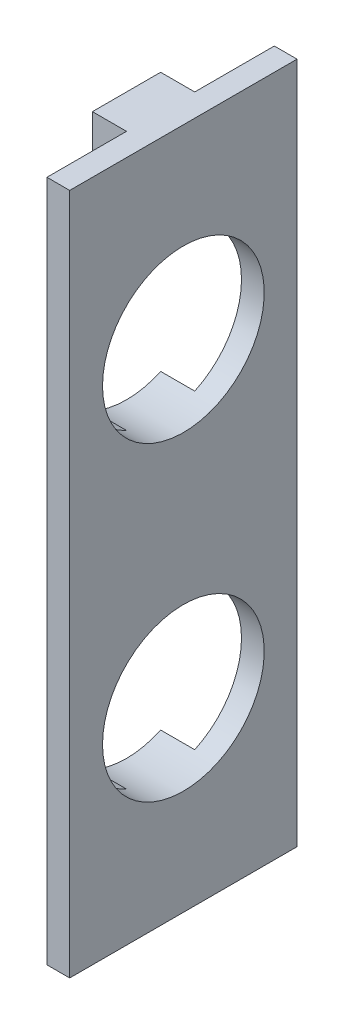
ISO-10303-21;
HEADER;
FILE_DESCRIPTION(('STEP AP214'),'2;1');
FILE_NAME('part.step','',(''),(''),'','','');
FILE_SCHEMA(('AUTOMOTIVE_DESIGN { 1 0 10303 214 1 1 1 1 }'));
ENDSEC;
DATA;
#1=APPLICATION_CONTEXT('core data for automotive mechanical design processes');
#2=APPLICATION_PROTOCOL_DEFINITION('international standard','automotive_design',2000,#1);
#3=PRODUCT_CONTEXT('',#1,'mechanical');
#4=PRODUCT('Part','Part','',(#3));
#5=PRODUCT_RELATED_PRODUCT_CATEGORY('part','',(#4));
#6=PRODUCT_DEFINITION_FORMATION('','',#4);
#7=PRODUCT_DEFINITION_CONTEXT('part definition',#1,'design');
#8=PRODUCT_DEFINITION('design','',#6,#7);
#9=PRODUCT_DEFINITION_SHAPE('','',#8);
#10=(LENGTH_UNIT() NAMED_UNIT(*) SI_UNIT(.MILLI.,.METRE.));
#11=(NAMED_UNIT(*) PLANE_ANGLE_UNIT() SI_UNIT($,.RADIAN.));
#12=(NAMED_UNIT(*) SI_UNIT($,.STERADIAN.) SOLID_ANGLE_UNIT());
#13=UNCERTAINTY_MEASURE_WITH_UNIT(LENGTH_MEASURE(1.E-05),#10,'distance_accuracy_value','');
#14=(GEOMETRIC_REPRESENTATION_CONTEXT(3) GLOBAL_UNCERTAINTY_ASSIGNED_CONTEXT((#13)) GLOBAL_UNIT_ASSIGNED_CONTEXT((#10,
#11,#12)) REPRESENTATION_CONTEXT('',''));
#15=CARTESIAN_POINT('',(0.,0.,0.));
#16=DIRECTION('',(0.,0.,1.));
#17=DIRECTION('',(1.,0.,0.));
#18=AXIS2_PLACEMENT_3D('',#15,#16,#17);
#19=CARTESIAN_POINT('',(-1.62605042016807,30.,0.));
#20=DIRECTION('',(0.,0.,-1.));
#21=DIRECTION('',(-1.,0.,0.));
#22=AXIS2_PLACEMENT_3D('',#19,#20,#21);
#23=PLANE('',#22);
#24=DIRECTION('',(0.,-1.,0.));
#25=VECTOR('',#24,1.);
#26=CARTESIAN_POINT('',(-1.62605042016807,30.,0.));
#27=LINE('',#26,#25);
#28=CARTESIAN_POINT('',(-1.62605042016807,4.94585901655065,0.));
#29=VERTEX_POINT('',#28);
#30=CARTESIAN_POINT('',(-1.62605042016807,0.,0.));
#31=VERTEX_POINT('',#30);
#32=EDGE_CURVE('E258',#29,#31,#27,.T.);
#33=ORIENTED_EDGE('',*,*,#32,.F.);
#34=DIRECTION('',(-1.,0.,0.));
#35=VECTOR('',#34,1.);
#36=CARTESIAN_POINT('',(26.8739495798319,4.94585901655065,0.));
#37=LINE('',#36,#35);
#38=CARTESIAN_POINT('',(-3.12605042016807,4.94585901655065,0.));
#39=VERTEX_POINT('',#38);
#40=EDGE_CURVE('E259',#29,#39,#37,.T.);
#41=ORIENTED_EDGE('',*,*,#40,.T.);
#42=DIRECTION('',(0.,-1.,0.));
#43=VECTOR('',#42,1.);
#44=CARTESIAN_POINT('',(-3.12605042016807,30.,0.));
#45=LINE('',#44,#43);
#46=CARTESIAN_POINT('',(-3.12605042016807,0.,0.));
#47=VERTEX_POINT('',#46);
#48=EDGE_CURVE('E158',#39,#47,#45,.T.);
#49=ORIENTED_EDGE('',*,*,#48,.T.);
#50=DIRECTION('',(1.,0.,0.));
#51=VECTOR('',#50,1.);
#52=CARTESIAN_POINT('',(-1.62605042016807,0.,0.));
#53=LINE('',#52,#51);
#54=EDGE_CURVE('E211',#47,#31,#53,.T.);
#55=ORIENTED_EDGE('',*,*,#54,.T.);
#56=EDGE_LOOP('',(#33,#41,#49,#55));
#57=FACE_BOUND('',#56,.T.);
#58=ADVANCED_FACE('F33',(#57),#23,.F.);
#59=CARTESIAN_POINT('',(-3.12605042016807,30.,-3.));
#60=DIRECTION('',(0.,0.,1.));
#61=DIRECTION('',(1.,0.,0.));
#62=AXIS2_PLACEMENT_3D('',#59,#60,#61);
#63=PLANE('',#62);
#64=DIRECTION('',(0.,-1.,0.));
#65=VECTOR('',#64,1.);
#66=CARTESIAN_POINT('',(-1.62605042016807,30.,-3.));
#67=LINE('',#66,#65);
#68=CARTESIAN_POINT('',(-1.62605042016807,18.605843223575,-3.));
#69=VERTEX_POINT('',#68);
#70=CARTESIAN_POINT('',(-1.62605042016807,11.394156776425,-3.));
#71=VERTEX_POINT('',#70);
#72=EDGE_CURVE('E185',#69,#71,#67,.T.);
#73=ORIENTED_EDGE('',*,*,#72,.T.);
#74=DIRECTION('',(-1.,0.,0.));
#75=VECTOR('',#74,1.);
#76=CARTESIAN_POINT('',(26.8739495798319,11.394156776425,-3.));
#77=LINE('',#76,#75);
#78=CARTESIAN_POINT('',(-3.12605042016807,11.394156776425,-3.));
#79=VERTEX_POINT('',#78);
#80=EDGE_CURVE('E48',#71,#79,#77,.T.);
#81=ORIENTED_EDGE('',*,*,#80,.T.);
#82=DIRECTION('',(0.,-1.,0.));
#83=VECTOR('',#82,1.);
#84=CARTESIAN_POINT('',(-3.12605042016807,30.,-3.));
#85=LINE('',#84,#83);
#86=CARTESIAN_POINT('',(-3.12605042016807,18.605843223575,-3.));
#87=VERTEX_POINT('',#86);
#88=EDGE_CURVE('E164',#87,#79,#85,.T.);
#89=ORIENTED_EDGE('',*,*,#88,.F.);
#90=DIRECTION('',(-1.,0.,0.));
#91=VECTOR('',#90,1.);
#92=CARTESIAN_POINT('',(26.8739495798319,18.605843223575,-3.));
#93=LINE('',#92,#91);
#94=EDGE_CURVE('E297',#87,#69,#93,.F.);
#95=ORIENTED_EDGE('',*,*,#94,.T.);
#96=EDGE_LOOP('',(#73,#81,#89,#95));
#97=FACE_BOUND('',#96,.T.);
#98=ADVANCED_FACE('F319',(#97),#63,.F.);
#99=CARTESIAN_POINT('',(-3.12605042016807,30.,0.));
#100=DIRECTION('',(1.,0.,0.));
#101=DIRECTION('',(0.,0.,-1.));
#102=AXIS2_PLACEMENT_3D('',#99,#100,#101);
#103=PLANE('',#102);
#104=ORIENTED_EDGE('',*,*,#88,.T.);
#105=CARTESIAN_POINT('',(-3.12605042016807,8.1700078964878,-1.5));
#106=DIRECTION('',(-1.,0.,0.));
#107=DIRECTION('',(0.,0.,-1.));
#108=AXIS2_PLACEMENT_3D('',#105,#106,#107);
#109=CIRCLE('',#108,3.556);
#110=CARTESIAN_POINT('',(-3.12605042016807,11.394156776425,0.));
#111=VERTEX_POINT('',#110);
#112=EDGE_CURVE('E159',#111,#79,#109,.T.);
#113=ORIENTED_EDGE('',*,*,#112,.F.);
#114=CARTESIAN_POINT('',(-3.12605042016807,18.605843223575,0.));
#115=VERTEX_POINT('',#114);
#116=EDGE_CURVE('E170',#115,#111,#45,.T.);
#117=ORIENTED_EDGE('',*,*,#116,.F.);
#118=CARTESIAN_POINT('',(-3.12605042016807,21.8299921035122,-1.5));
#119=DIRECTION('',(-1.,0.,0.));
#120=DIRECTION('',(0.,0.,1.));
#121=AXIS2_PLACEMENT_3D('',#118,#119,#120);
#122=CIRCLE('',#121,3.556);
#123=EDGE_CURVE('E289',#87,#115,#122,.T.);
#124=ORIENTED_EDGE('',*,*,#123,.F.);
#125=EDGE_LOOP('',(#104,#113,#117,#124));
#126=FACE_BOUND('',#125,.T.);
#127=ADVANCED_FACE('F313',(#126),#103,.F.);
#128=CARTESIAN_POINT('',(-1.62605042016807,30.,-3.));
#129=VERTEX_POINT('',#128);
#130=CARTESIAN_POINT('',(-1.62605042016807,25.0541409834494,-3.));
#131=VERTEX_POINT('',#130);
#132=EDGE_CURVE('E182',#129,#131,#67,.T.);
#133=ORIENTED_EDGE('',*,*,#132,.T.);
#134=DIRECTION('',(-1.,0.,0.));
#135=VECTOR('',#134,1.);
#136=CARTESIAN_POINT('',(26.8739495798319,25.0541409834494,-3.));
#137=LINE('',#136,#135);
#138=CARTESIAN_POINT('',(-3.12605042016807,25.0541409834494,-3.));
#139=VERTEX_POINT('',#138);
#140=EDGE_CURVE('E55',#131,#139,#137,.T.);
#141=ORIENTED_EDGE('',*,*,#140,.T.);
#142=CARTESIAN_POINT('',(-3.12605042016807,30.,-3.));
#143=VERTEX_POINT('',#142);
#144=EDGE_CURVE('E167',#143,#139,#85,.T.);
#145=ORIENTED_EDGE('',*,*,#144,.F.);
#146=DIRECTION('',(-1.,0.,0.));
#147=VECTOR('',#146,1.);
#148=CARTESIAN_POINT('',(-3.12605042016807,30.,-3.));
#149=LINE('',#148,#147);
#150=EDGE_CURVE('E190',#129,#143,#149,.T.);
#151=ORIENTED_EDGE('',*,*,#150,.F.);
#152=EDGE_LOOP('',(#133,#141,#145,#151));
#153=FACE_BOUND('',#152,.T.);
#154=ADVANCED_FACE('F188',(#153),#63,.F.);
#155=ORIENTED_EDGE('',*,*,#144,.T.);
#156=CARTESIAN_POINT('',(-3.12605042016807,25.0541409834494,0.));
#157=VERTEX_POINT('',#156);
#158=EDGE_CURVE('E295',#157,#139,#122,.T.);
#159=ORIENTED_EDGE('',*,*,#158,.F.);
#160=CARTESIAN_POINT('',(-3.12605042016807,30.,0.));
#161=VERTEX_POINT('',#160);
#162=EDGE_CURVE('E165',#161,#157,#45,.T.);
#163=ORIENTED_EDGE('',*,*,#162,.F.);
#164=DIRECTION('',(0.,0.,1.));
#165=VECTOR('',#164,1.);
#166=CARTESIAN_POINT('',(-3.12605042016807,30.,0.));
#167=LINE('',#166,#165);
#168=EDGE_CURVE('E223',#143,#161,#167,.T.);
#169=ORIENTED_EDGE('',*,*,#168,.F.);
#170=EDGE_LOOP('',(#155,#159,#163,#169));
#171=FACE_BOUND('',#170,.T.);
#172=ADVANCED_FACE('F311',(#171),#103,.F.);
#173=ORIENTED_EDGE('',*,*,#116,.T.);
#174=DIRECTION('',(-1.,0.,0.));
#175=VECTOR('',#174,1.);
#176=CARTESIAN_POINT('',(26.8739495798319,11.394156776425,0.));
#177=LINE('',#176,#175);
#178=CARTESIAN_POINT('',(-1.62605042016807,11.394156776425,0.));
#179=VERTEX_POINT('',#178);
#180=EDGE_CURVE('E286',#111,#179,#177,.F.);
#181=ORIENTED_EDGE('',*,*,#180,.T.);
#182=CARTESIAN_POINT('',(-1.62605042016807,18.605843223575,0.));
#183=VERTEX_POINT('',#182);
#184=EDGE_CURVE('E263',#183,#179,#27,.T.);
#185=ORIENTED_EDGE('',*,*,#184,.F.);
#186=DIRECTION('',(-1.,0.,0.));
#187=VECTOR('',#186,1.);
#188=CARTESIAN_POINT('',(26.8739495798319,18.605843223575,0.));
#189=LINE('',#188,#187);
#190=EDGE_CURVE('E209',#183,#115,#189,.T.);
#191=ORIENTED_EDGE('',*,*,#190,.T.);
#192=EDGE_LOOP('',(#173,#181,#185,#191));
#193=FACE_BOUND('',#192,.T.);
#194=ADVANCED_FACE('F284',(#193),#23,.F.);
#195=CARTESIAN_POINT('',(-3.12605042016807,4.94585901655065,-3.));
#196=VERTEX_POINT('',#195);
#197=CARTESIAN_POINT('',(-3.12605042016807,0.,-3.));
#198=VERTEX_POINT('',#197);
#199=EDGE_CURVE('E156',#196,#198,#85,.T.);
#200=ORIENTED_EDGE('',*,*,#199,.F.);
#201=DIRECTION('',(-1.,0.,0.));
#202=VECTOR('',#201,1.);
#203=CARTESIAN_POINT('',(26.8739495798319,4.94585901655065,-3.));
#204=LINE('',#203,#202);
#205=CARTESIAN_POINT('',(-1.62605042016807,4.94585901655065,-3.));
#206=VERTEX_POINT('',#205);
#207=EDGE_CURVE('E143',#196,#206,#204,.F.);
#208=ORIENTED_EDGE('',*,*,#207,.T.);
#209=CARTESIAN_POINT('',(-1.62605042016807,0.,-3.));
#210=VERTEX_POINT('',#209);
#211=EDGE_CURVE('E193',#206,#210,#67,.T.);
#212=ORIENTED_EDGE('',*,*,#211,.T.);
#213=DIRECTION('',(-1.,0.,0.));
#214=VECTOR('',#213,1.);
#215=CARTESIAN_POINT('',(-3.12605042016807,0.,-3.));
#216=LINE('',#215,#214);
#217=EDGE_CURVE('E163',#210,#198,#216,.T.);
#218=ORIENTED_EDGE('',*,*,#217,.T.);
#219=EDGE_LOOP('',(#200,#208,#212,#218));
#220=FACE_BOUND('',#219,.T.);
#221=ADVANCED_FACE('F35',(#220),#63,.F.);
#222=ORIENTED_EDGE('',*,*,#48,.F.);
#223=EDGE_CURVE('E146',#196,#39,#109,.T.);
#224=ORIENTED_EDGE('',*,*,#223,.F.);
#225=ORIENTED_EDGE('',*,*,#199,.T.);
#226=DIRECTION('',(0.,0.,1.));
#227=VECTOR('',#226,1.);
#228=CARTESIAN_POINT('',(-3.12605042016807,0.,0.));
#229=LINE('',#228,#227);
#230=EDGE_CURVE('E208',#198,#47,#229,.T.);
#231=ORIENTED_EDGE('',*,*,#230,.T.);
#232=EDGE_LOOP('',(#222,#224,#225,#231));
#233=FACE_BOUND('',#232,.T.);
#234=ADVANCED_FACE('F154',(#233),#103,.F.);
#235=ORIENTED_EDGE('',*,*,#162,.T.);
#236=DIRECTION('',(-1.,0.,0.));
#237=VECTOR('',#236,1.);
#238=CARTESIAN_POINT('',(26.8739495798319,25.0541409834494,0.));
#239=LINE('',#238,#237);
#240=CARTESIAN_POINT('',(-1.62605042016807,25.0541409834494,0.));
#241=VERTEX_POINT('',#240);
#242=EDGE_CURVE('E303',#157,#241,#239,.F.);
#243=ORIENTED_EDGE('',*,*,#242,.T.);
#244=CARTESIAN_POINT('',(-1.62605042016807,30.,0.));
#245=VERTEX_POINT('',#244);
#246=EDGE_CURVE('E260',#245,#241,#27,.T.);
#247=ORIENTED_EDGE('',*,*,#246,.F.);
#248=DIRECTION('',(1.,0.,0.));
#249=VECTOR('',#248,1.);
#250=CARTESIAN_POINT('',(-1.62605042016807,30.,0.));
#251=LINE('',#250,#249);
#252=EDGE_CURVE('E225',#161,#245,#251,.T.);
#253=ORIENTED_EDGE('',*,*,#252,.F.);
#254=EDGE_LOOP('',(#235,#243,#247,#253));
#255=FACE_BOUND('',#254,.T.);
#256=ADVANCED_FACE('F307',(#255),#23,.F.);
#257=CARTESIAN_POINT('',(-1.62605042016807,30.,3.5));
#258=DIRECTION('',(1.,0.,0.));
#259=DIRECTION('',(0.,0.,-1.));
#260=AXIS2_PLACEMENT_3D('',#257,#258,#259);
#261=PLANE('',#260);
#262=ORIENTED_EDGE('',*,*,#184,.T.);
#263=CARTESIAN_POINT('',(-1.62605042016807,8.1700078964878,-1.5));
#264=DIRECTION('',(1.,0.,0.));
#265=DIRECTION('',(0.,0.,-1.));
#266=AXIS2_PLACEMENT_3D('',#263,#264,#265);
#267=CIRCLE('',#266,3.556);
#268=EDGE_CURVE('E277',#179,#29,#267,.T.);
#269=ORIENTED_EDGE('',*,*,#268,.T.);
#270=ORIENTED_EDGE('',*,*,#32,.T.);
#271=DIRECTION('',(0.,0.,1.));
#272=VECTOR('',#271,1.);
#273=CARTESIAN_POINT('',(-1.62605042016807,0.,3.5));
#274=LINE('',#273,#272);
#275=CARTESIAN_POINT('',(-1.62605042016807,0.,3.5));
#276=VERTEX_POINT('',#275);
#277=EDGE_CURVE('E214',#31,#276,#274,.T.);
#278=ORIENTED_EDGE('',*,*,#277,.T.);
#279=DIRECTION('',(0.,-1.,0.));
#280=VECTOR('',#279,1.);
#281=CARTESIAN_POINT('',(-1.62605042016807,30.,3.5));
#282=LINE('',#281,#280);
#283=CARTESIAN_POINT('',(-1.62605042016807,30.,3.5));
#284=VERTEX_POINT('',#283);
#285=EDGE_CURVE('E266',#284,#276,#282,.T.);
#286=ORIENTED_EDGE('',*,*,#285,.F.);
#287=DIRECTION('',(0.,0.,1.));
#288=VECTOR('',#287,1.);
#289=CARTESIAN_POINT('',(-1.62605042016807,30.,3.5));
#290=LINE('',#289,#288);
#291=EDGE_CURVE('E231',#245,#284,#290,.T.);
#292=ORIENTED_EDGE('',*,*,#291,.F.);
#293=ORIENTED_EDGE('',*,*,#246,.T.);
#294=CARTESIAN_POINT('',(-1.62605042016807,21.8299921035122,-1.5));
#295=DIRECTION('',(1.,0.,0.));
#296=DIRECTION('',(0.,0.,-1.));
#297=AXIS2_PLACEMENT_3D('',#294,#295,#296);
#298=CIRCLE('',#297,3.556);
#299=EDGE_CURVE('E280',#241,#183,#298,.T.);
#300=ORIENTED_EDGE('',*,*,#299,.T.);
#301=EDGE_LOOP('',(#262,#269,#270,#278,#286,#292,#293,#300));
#302=FACE_BOUND('',#301,.T.);
#303=ADVANCED_FACE('F275',(#302),#261,.F.);
#304=CARTESIAN_POINT('',(-0.62605042016807,30.,3.5));
#305=DIRECTION('',(0.,0.,-1.));
#306=DIRECTION('',(-1.,0.,0.));
#307=AXIS2_PLACEMENT_3D('',#304,#305,#306);
#308=PLANE('',#307);
#309=DIRECTION('',(1.,0.,0.));
#310=VECTOR('',#309,1.);
#311=CARTESIAN_POINT('',(-0.62605042016807,0.,3.5));
#312=LINE('',#311,#310);
#313=CARTESIAN_POINT('',(-0.62605042016807,0.,3.5));
#314=VERTEX_POINT('',#313);
#315=EDGE_CURVE('E216',#276,#314,#312,.T.);
#316=ORIENTED_EDGE('',*,*,#315,.T.);
#317=DIRECTION('',(0.,-1.,0.));
#318=VECTOR('',#317,1.);
#319=CARTESIAN_POINT('',(-0.62605042016807,30.,3.5));
#320=LINE('',#319,#318);
#321=CARTESIAN_POINT('',(-0.62605042016807,30.,3.5));
#322=VERTEX_POINT('',#321);
#323=EDGE_CURVE('E248',#322,#314,#320,.T.);
#324=ORIENTED_EDGE('',*,*,#323,.F.);
#325=DIRECTION('',(1.,0.,0.));
#326=VECTOR('',#325,1.);
#327=CARTESIAN_POINT('',(-0.62605042016807,30.,3.5));
#328=LINE('',#327,#326);
#329=EDGE_CURVE('E233',#284,#322,#328,.T.);
#330=ORIENTED_EDGE('',*,*,#329,.F.);
#331=ORIENTED_EDGE('',*,*,#285,.T.);
#332=EDGE_LOOP('',(#316,#324,#330,#331));
#333=FACE_BOUND('',#332,.T.);
#334=ADVANCED_FACE('F270',(#333),#308,.F.);
#335=CARTESIAN_POINT('',(-0.62605042016807,30.,-6.5));
#336=DIRECTION('',(-1.,0.,0.));
#337=DIRECTION('',(0.,0.,1.));
#338=AXIS2_PLACEMENT_3D('',#335,#336,#337);
#339=PLANE('',#338);
#340=CARTESIAN_POINT('',(-0.62605042016807,8.1700078964878,-1.5));
#341=DIRECTION('',(-1.,0.,0.));
#342=DIRECTION('',(0.,0.,1.));
#343=AXIS2_PLACEMENT_3D('',#340,#341,#342);
#344=CIRCLE('',#343,3.556);
#345=CARTESIAN_POINT('',(-0.62605042016807,8.1700078964878,2.056));
#346=VERTEX_POINT('',#345);
#347=EDGE_CURVE('E291',#346,#346,#344,.T.);
#348=ORIENTED_EDGE('',*,*,#347,.T.);
#349=EDGE_LOOP('',(#348));
#350=FACE_BOUND('',#349,.T.);
#351=CARTESIAN_POINT('',(-0.62605042016807,21.8299921035122,-1.5));
#352=DIRECTION('',(-1.,0.,0.));
#353=DIRECTION('',(0.,0.,1.));
#354=AXIS2_PLACEMENT_3D('',#351,#352,#353);
#355=CIRCLE('',#354,3.556);
#356=CARTESIAN_POINT('',(-0.62605042016807,21.8299921035122,2.056));
#357=VERTEX_POINT('',#356);
#358=EDGE_CURVE('E300',#357,#357,#355,.T.);
#359=ORIENTED_EDGE('',*,*,#358,.T.);
#360=EDGE_LOOP('',(#359));
#361=FACE_BOUND('',#360,.T.);
#362=DIRECTION('',(0.,0.,-1.));
#363=VECTOR('',#362,1.);
#364=CARTESIAN_POINT('',(-0.62605042016807,0.,-6.5));
#365=LINE('',#364,#363);
#366=CARTESIAN_POINT('',(-0.62605042016807,0.,-6.5));
#367=VERTEX_POINT('',#366);
#368=EDGE_CURVE('E218',#314,#367,#365,.T.);
#369=ORIENTED_EDGE('',*,*,#368,.T.);
#370=DIRECTION('',(0.,-1.,0.));
#371=VECTOR('',#370,1.);
#372=CARTESIAN_POINT('',(-0.62605042016807,30.,-6.5));
#373=LINE('',#372,#371);
#374=CARTESIAN_POINT('',(-0.62605042016807,30.,-6.5));
#375=VERTEX_POINT('',#374);
#376=EDGE_CURVE('E195',#375,#367,#373,.T.);
#377=ORIENTED_EDGE('',*,*,#376,.F.);
#378=DIRECTION('',(0.,0.,-1.));
#379=VECTOR('',#378,1.);
#380=CARTESIAN_POINT('',(-0.62605042016807,30.,-6.5));
#381=LINE('',#380,#379);
#382=EDGE_CURVE('E203',#322,#375,#381,.T.);
#383=ORIENTED_EDGE('',*,*,#382,.F.);
#384=ORIENTED_EDGE('',*,*,#323,.T.);
#385=EDGE_LOOP('',(#369,#377,#383,#384));
#386=FACE_BOUND('',#385,.T.);
#387=ADVANCED_FACE('F244',(#350,#361,#386),#339,.F.);
#388=CARTESIAN_POINT('',(-1.62605042016807,30.,-6.5));
#389=DIRECTION('',(0.,0.,1.));
#390=DIRECTION('',(1.,0.,0.));
#391=AXIS2_PLACEMENT_3D('',#388,#389,#390);
#392=PLANE('',#391);
#393=DIRECTION('',(-1.,0.,0.));
#394=VECTOR('',#393,1.);
#395=CARTESIAN_POINT('',(-1.62605042016807,0.,-6.5));
#396=LINE('',#395,#394);
#397=CARTESIAN_POINT('',(-1.62605042016807,0.,-6.5));
#398=VERTEX_POINT('',#397);
#399=EDGE_CURVE('E220',#367,#398,#396,.T.);
#400=ORIENTED_EDGE('',*,*,#399,.T.);
#401=DIRECTION('',(0.,-1.,0.));
#402=VECTOR('',#401,1.);
#403=CARTESIAN_POINT('',(-1.62605042016807,30.,-6.5));
#404=LINE('',#403,#402);
#405=CARTESIAN_POINT('',(-1.62605042016807,30.,-6.5));
#406=VERTEX_POINT('',#405);
#407=EDGE_CURVE('E191',#406,#398,#404,.T.);
#408=ORIENTED_EDGE('',*,*,#407,.F.);
#409=DIRECTION('',(-1.,0.,0.));
#410=VECTOR('',#409,1.);
#411=CARTESIAN_POINT('',(-1.62605042016807,30.,-6.5));
#412=LINE('',#411,#410);
#413=EDGE_CURVE('E200',#375,#406,#412,.T.);
#414=ORIENTED_EDGE('',*,*,#413,.F.);
#415=ORIENTED_EDGE('',*,*,#376,.T.);
#416=EDGE_LOOP('',(#400,#408,#414,#415));
#417=FACE_BOUND('',#416,.T.);
#418=ADVANCED_FACE('F250',(#417),#392,.F.);
#419=CARTESIAN_POINT('',(-1.62605042016807,30.,-3.));
#420=DIRECTION('',(1.,0.,0.));
#421=DIRECTION('',(0.,0.,-1.));
#422=AXIS2_PLACEMENT_3D('',#419,#420,#421);
#423=PLANE('',#422);
#424=ORIENTED_EDGE('',*,*,#211,.F.);
#425=CARTESIAN_POINT('',(-1.62605042016807,8.1700078964878,-1.5));
#426=DIRECTION('',(1.,0.,0.));
#427=DIRECTION('',(0.,0.,-1.));
#428=AXIS2_PLACEMENT_3D('',#425,#426,#427);
#429=CIRCLE('',#428,3.556);
#430=EDGE_CURVE('E11',#206,#71,#429,.T.);
#431=ORIENTED_EDGE('',*,*,#430,.T.);
#432=ORIENTED_EDGE('',*,*,#72,.F.);
#433=CARTESIAN_POINT('',(-1.62605042016807,21.8299921035122,-1.5));
#434=DIRECTION('',(1.,0.,0.));
#435=DIRECTION('',(0.,0.,-1.));
#436=AXIS2_PLACEMENT_3D('',#433,#434,#435);
#437=CIRCLE('',#436,3.556);
#438=EDGE_CURVE('E41',#69,#131,#437,.T.);
#439=ORIENTED_EDGE('',*,*,#438,.T.);
#440=ORIENTED_EDGE('',*,*,#132,.F.);
#441=DIRECTION('',(0.,0.,1.));
#442=VECTOR('',#441,1.);
#443=CARTESIAN_POINT('',(-1.62605042016807,30.,-3.));
#444=LINE('',#443,#442);
#445=EDGE_CURVE('E198',#406,#129,#444,.T.);
#446=ORIENTED_EDGE('',*,*,#445,.F.);
#447=ORIENTED_EDGE('',*,*,#407,.T.);
#448=DIRECTION('',(0.,0.,1.));
#449=VECTOR('',#448,1.);
#450=CARTESIAN_POINT('',(-1.62605042016807,0.,-3.));
#451=LINE('',#450,#449);
#452=EDGE_CURVE('E221',#398,#210,#451,.T.);
#453=ORIENTED_EDGE('',*,*,#452,.T.);
#454=EDGE_LOOP('',(#424,#431,#432,#439,#440,#446,#447,#453));
#455=FACE_BOUND('',#454,.T.);
#456=ADVANCED_FACE('F180',(#455),#423,.F.);
#457=CARTESIAN_POINT('',(0.,30.,0.));
#458=DIRECTION('',(0.,1.,0.));
#459=DIRECTION('',(0.,0.,1.));
#460=AXIS2_PLACEMENT_3D('',#457,#458,#459);
#461=PLANE('',#460);
#462=ORIENTED_EDGE('',*,*,#150,.T.);
#463=ORIENTED_EDGE('',*,*,#168,.T.);
#464=ORIENTED_EDGE('',*,*,#252,.T.);
#465=ORIENTED_EDGE('',*,*,#291,.T.);
#466=ORIENTED_EDGE('',*,*,#329,.T.);
#467=ORIENTED_EDGE('',*,*,#382,.T.);
#468=ORIENTED_EDGE('',*,*,#413,.T.);
#469=ORIENTED_EDGE('',*,*,#445,.T.);
#470=EDGE_LOOP('',(#462,#463,#464,#465,#466,#467,#468,#469));
#471=FACE_BOUND('',#470,.T.);
#472=ADVANCED_FACE('F236',(#471),#461,.T.);
#473=CARTESIAN_POINT('',(0.,0.,0.));
#474=DIRECTION('',(0.,1.,0.));
#475=DIRECTION('',(0.,0.,1.));
#476=AXIS2_PLACEMENT_3D('',#473,#474,#475);
#477=PLANE('',#476);
#478=ORIENTED_EDGE('',*,*,#217,.F.);
#479=ORIENTED_EDGE('',*,*,#452,.F.);
#480=ORIENTED_EDGE('',*,*,#399,.F.);
#481=ORIENTED_EDGE('',*,*,#368,.F.);
#482=ORIENTED_EDGE('',*,*,#315,.F.);
#483=ORIENTED_EDGE('',*,*,#277,.F.);
#484=ORIENTED_EDGE('',*,*,#54,.F.);
#485=ORIENTED_EDGE('',*,*,#230,.F.);
#486=EDGE_LOOP('',(#478,#479,#480,#481,#482,#483,#484,#485));
#487=FACE_BOUND('',#486,.T.);
#488=ADVANCED_FACE('F252',(#487),#477,.F.);
#489=CARTESIAN_POINT('',(26.8739495798319,21.8299921035122,-1.5));
#490=DIRECTION('',(-1.,0.,0.));
#491=DIRECTION('',(0.,0.,1.));
#492=AXIS2_PLACEMENT_3D('',#489,#490,#491);
#493=CYLINDRICAL_SURFACE('',#492,3.556);
#494=ORIENTED_EDGE('',*,*,#358,.F.);
#495=EDGE_LOOP('',(#494));
#496=FACE_BOUND('',#495,.T.);
#497=ORIENTED_EDGE('',*,*,#299,.F.);
#498=ORIENTED_EDGE('',*,*,#242,.F.);
#499=ORIENTED_EDGE('',*,*,#158,.T.);
#500=ORIENTED_EDGE('',*,*,#140,.F.);
#501=ORIENTED_EDGE('',*,*,#438,.F.);
#502=ORIENTED_EDGE('',*,*,#94,.F.);
#503=ORIENTED_EDGE('',*,*,#123,.T.);
#504=ORIENTED_EDGE('',*,*,#190,.F.);
#505=EDGE_LOOP('',(#497,#498,#499,#500,#501,#502,#503,#504));
#506=FACE_BOUND('',#505,.T.);
#507=ADVANCED_FACE('F310',(#496,#506),#493,.F.);
#508=CARTESIAN_POINT('',(26.8739495798319,8.1700078964878,-1.5));
#509=DIRECTION('',(-1.,0.,0.));
#510=DIRECTION('',(0.,0.,1.));
#511=AXIS2_PLACEMENT_3D('',#508,#509,#510);
#512=CYLINDRICAL_SURFACE('',#511,3.556);
#513=ORIENTED_EDGE('',*,*,#347,.F.);
#514=EDGE_LOOP('',(#513));
#515=FACE_BOUND('',#514,.T.);
#516=ORIENTED_EDGE('',*,*,#268,.F.);
#517=ORIENTED_EDGE('',*,*,#180,.F.);
#518=ORIENTED_EDGE('',*,*,#112,.T.);
#519=ORIENTED_EDGE('',*,*,#80,.F.);
#520=ORIENTED_EDGE('',*,*,#430,.F.);
#521=ORIENTED_EDGE('',*,*,#207,.F.);
#522=ORIENTED_EDGE('',*,*,#223,.T.);
#523=ORIENTED_EDGE('',*,*,#40,.F.);
#524=EDGE_LOOP('',(#516,#517,#518,#519,#520,#521,#522,#523));
#525=FACE_BOUND('',#524,.T.);
#526=ADVANCED_FACE('F145',(#515,#525),#512,.F.);
#527=CLOSED_SHELL('',(#58,#98,#127,#154,#172,#194,#221,#234,#256,#303,#334,#387,#418,#456,#472,
#488,#507,#526));
#528=MANIFOLD_SOLID_BREP('B2',#527);
#529=ADVANCED_BREP_SHAPE_REPRESENTATION('',(#18,#528),#14);
#530=SHAPE_DEFINITION_REPRESENTATION(#9,#529);
ENDSEC;
END-ISO-10303-21;
